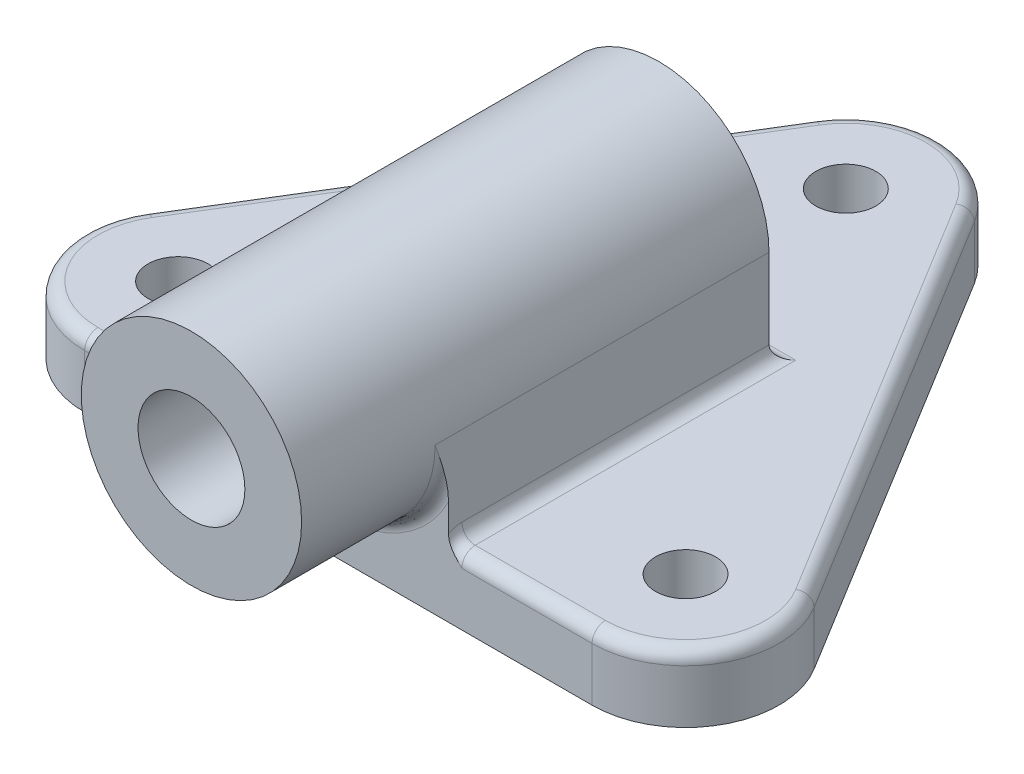
ISO-10303-21;
HEADER;
FILE_DESCRIPTION(('STEP AP214'),'2;1');
FILE_NAME('part.step','',(''),(''),'','','');
FILE_SCHEMA(('AUTOMOTIVE_DESIGN { 1 0 10303 214 1 1 1 1 }'));
ENDSEC;
DATA;
#1=APPLICATION_CONTEXT('core data for automotive mechanical design processes');
#2=APPLICATION_PROTOCOL_DEFINITION('international standard','automotive_design',2000,#1);
#3=PRODUCT_CONTEXT('',#1,'mechanical');
#4=PRODUCT('Part','Part','',(#3));
#5=PRODUCT_RELATED_PRODUCT_CATEGORY('part','',(#4));
#6=PRODUCT_DEFINITION_FORMATION('','',#4);
#7=PRODUCT_DEFINITION_CONTEXT('part definition',#1,'design');
#8=PRODUCT_DEFINITION('design','',#6,#7);
#9=PRODUCT_DEFINITION_SHAPE('','',#8);
#10=(LENGTH_UNIT() NAMED_UNIT(*) SI_UNIT(.MILLI.,.METRE.));
#11=(NAMED_UNIT(*) PLANE_ANGLE_UNIT() SI_UNIT($,.RADIAN.));
#12=(NAMED_UNIT(*) SI_UNIT($,.STERADIAN.) SOLID_ANGLE_UNIT());
#13=UNCERTAINTY_MEASURE_WITH_UNIT(LENGTH_MEASURE(1.E-05),#10,'distance_accuracy_value','');
#14=(GEOMETRIC_REPRESENTATION_CONTEXT(3) GLOBAL_UNCERTAINTY_ASSIGNED_CONTEXT((#13)) GLOBAL_UNIT_ASSIGNED_CONTEXT((#10,
#11,#12)) REPRESENTATION_CONTEXT('',''));
#15=CARTESIAN_POINT('',(0.,0.,0.));
#16=DIRECTION('',(0.,0.,1.));
#17=DIRECTION('',(1.,0.,0.));
#18=AXIS2_PLACEMENT_3D('',#15,#16,#17);
#19=CARTESIAN_POINT('',(38.,10.,-14.));
#20=DIRECTION('',(0.,1.,0.));
#21=DIRECTION('',(0.,0.,1.));
#22=AXIS2_PLACEMENT_3D('',#19,#20,#21);
#23=PLANE('',#22);
#24=DIRECTION('',(1.,0.,0.));
#25=VECTOR('',#24,1.);
#26=CARTESIAN_POINT('',(38.,10.,-50.));
#27=LINE('',#26,#25);
#28=CARTESIAN_POINT('',(-18.5,10.,-50.));
#29=VERTEX_POINT('',#28);
#30=CARTESIAN_POINT('',(18.5,10.,-50.));
#31=VERTEX_POINT('',#30);
#32=EDGE_CURVE('E448',#29,#31,#27,.T.);
#33=ORIENTED_EDGE('',*,*,#32,.T.);
#34=DIRECTION('',(0.,0.,1.));
#35=VECTOR('',#34,1.);
#36=CARTESIAN_POINT('',(18.5,10.,-14.));
#37=LINE('',#36,#35);
#38=CARTESIAN_POINT('',(18.5,10.,-2.));
#39=VERTEX_POINT('',#38);
#40=EDGE_CURVE('E321',#31,#39,#37,.T.);
#41=ORIENTED_EDGE('',*,*,#40,.T.);
#42=DIRECTION('',(1.,0.,0.));
#43=VECTOR('',#42,1.);
#44=CARTESIAN_POINT('',(38.,10.,-2.));
#45=LINE('',#44,#43);
#46=CARTESIAN_POINT('',(38.,10.,-2.00000000000001));
#47=VERTEX_POINT('',#46);
#48=EDGE_CURVE('E272',#39,#47,#45,.T.);
#49=ORIENTED_EDGE('',*,*,#48,.T.);
#50=CARTESIAN_POINT('',(38.,10.,-14.));
#51=DIRECTION('',(0.,1.,0.));
#52=DIRECTION('',(0.,0.,1.));
#53=AXIS2_PLACEMENT_3D('',#50,#51,#52);
#54=CIRCLE('',#53,12.);
#55=CARTESIAN_POINT('',(48.2312150289313,10.,-20.2707446951515));
#56=VERTEX_POINT('',#55);
#57=EDGE_CURVE('E259',#47,#56,#54,.T.);
#58=ORIENTED_EDGE('',*,*,#57,.T.);
#59=DIRECTION('',(-0.522562057929287,0.,-0.852601252410943));
#60=VECTOR('',#59,1.);
#61=CARTESIAN_POINT('',(10.2312150289313,10.,-82.2707446951515));
#62=LINE('',#61,#60);
#63=CARTESIAN_POINT('',(10.2312150289313,10.,-82.2707446951514));
#64=VERTEX_POINT('',#63);
#65=EDGE_CURVE('E261',#56,#64,#62,.T.);
#66=ORIENTED_EDGE('',*,*,#65,.T.);
#67=CARTESIAN_POINT('',(0.,10.,-76.));
#68=DIRECTION('',(0.,1.,0.));
#69=DIRECTION('',(0.,0.,1.));
#70=AXIS2_PLACEMENT_3D('',#67,#68,#69);
#71=CIRCLE('',#70,12.);
#72=CARTESIAN_POINT('',(-10.2312150289313,10.,-82.2707446951514));
#73=VERTEX_POINT('',#72);
#74=EDGE_CURVE('E263',#64,#73,#71,.T.);
#75=ORIENTED_EDGE('',*,*,#74,.T.);
#76=DIRECTION('',(-0.522562057929287,0.,0.852601252410943));
#77=VECTOR('',#76,1.);
#78=CARTESIAN_POINT('',(-48.2312150289313,10.,-20.2707446951514));
#79=LINE('',#78,#77);
#80=CARTESIAN_POINT('',(-48.2312150289313,10.,-20.2707446951514));
#81=VERTEX_POINT('',#80);
#82=EDGE_CURVE('E265',#73,#81,#79,.T.);
#83=ORIENTED_EDGE('',*,*,#82,.T.);
#84=CARTESIAN_POINT('',(-38.,10.,-14.));
#85=DIRECTION('',(0.,1.,0.));
#86=DIRECTION('',(0.,0.,1.));
#87=AXIS2_PLACEMENT_3D('',#84,#85,#86);
#88=CIRCLE('',#87,12.);
#89=CARTESIAN_POINT('',(-38.,10.,-2.));
#90=VERTEX_POINT('',#89);
#91=EDGE_CURVE('E267',#81,#90,#88,.T.);
#92=ORIENTED_EDGE('',*,*,#91,.T.);
#93=DIRECTION('',(1.,0.,0.));
#94=VECTOR('',#93,1.);
#95=CARTESIAN_POINT('',(-16.5,10.,-2.));
#96=LINE('',#95,#94);
#97=CARTESIAN_POINT('',(-18.5,10.,-1.99999999999999));
#98=VERTEX_POINT('',#97);
#99=EDGE_CURVE('E269',#90,#98,#96,.T.);
#100=ORIENTED_EDGE('',*,*,#99,.T.);
#101=DIRECTION('',(0.,0.,1.));
#102=VECTOR('',#101,1.);
#103=CARTESIAN_POINT('',(-18.5,10.,-48.));
#104=LINE('',#103,#102);
#105=EDGE_CURVE('E323',#98,#29,#104,.F.);
#106=ORIENTED_EDGE('',*,*,#105,.T.);
#107=EDGE_LOOP('',(#33,#41,#49,#58,#66,#75,#83,#92,#100,#106));
#108=FACE_BOUND('',#107,.T.);
#109=CARTESIAN_POINT('',(0.,10.,-76.));
#110=DIRECTION('',(0.,1.,0.));
#111=DIRECTION('',(0.,0.,1.));
#112=AXIS2_PLACEMENT_3D('',#109,#110,#111);
#113=CIRCLE('',#112,4.5);
#114=CARTESIAN_POINT('',(0.,10.,-71.5));
#115=VERTEX_POINT('',#114);
#116=EDGE_CURVE('E218',#115,#115,#113,.T.);
#117=ORIENTED_EDGE('',*,*,#116,.F.);
#118=EDGE_LOOP('',(#117));
#119=FACE_BOUND('',#118,.T.);
#120=CARTESIAN_POINT('',(-38.,10.,-14.));
#121=DIRECTION('',(0.,1.,0.));
#122=DIRECTION('',(0.,0.,1.));
#123=AXIS2_PLACEMENT_3D('',#120,#121,#122);
#124=CIRCLE('',#123,4.5);
#125=CARTESIAN_POINT('',(-38.,10.,-9.50000000000001));
#126=VERTEX_POINT('',#125);
#127=EDGE_CURVE('E224',#126,#126,#124,.T.);
#128=ORIENTED_EDGE('',*,*,#127,.F.);
#129=EDGE_LOOP('',(#128));
#130=FACE_BOUND('',#129,.T.);
#131=CARTESIAN_POINT('',(38.,10.,-14.));
#132=DIRECTION('',(0.,1.,0.));
#133=DIRECTION('',(0.,0.,1.));
#134=AXIS2_PLACEMENT_3D('',#131,#132,#133);
#135=CIRCLE('',#134,4.5);
#136=CARTESIAN_POINT('',(38.,10.,-9.50000000000002));
#137=VERTEX_POINT('',#136);
#138=EDGE_CURVE('E212',#137,#137,#135,.T.);
#139=ORIENTED_EDGE('',*,*,#138,.F.);
#140=EDGE_LOOP('',(#139));
#141=FACE_BOUND('',#140,.T.);
#142=ADVANCED_FACE('F53',(#108,#119,#130,#141),#23,.T.);
#143=CARTESIAN_POINT('',(0.,24.,-48.));
#144=DIRECTION('',(0.,0.,1.));
#145=DIRECTION('',(1.,0.,0.));
#146=AXIS2_PLACEMENT_3D('',#143,#144,#145);
#147=CYLINDRICAL_SURFACE('',#146,16.5);
#148=DIRECTION('',(0.,0.,1.));
#149=VECTOR('',#148,1.);
#150=CARTESIAN_POINT('',(-16.5,24.,-48.));
#151=LINE('',#150,#149);
#152=CARTESIAN_POINT('',(-16.5,24.,-48.));
#153=VERTEX_POINT('',#152);
#154=CARTESIAN_POINT('',(-16.5,24.,2.00000000000001));
#155=VERTEX_POINT('',#154);
#156=EDGE_CURVE('E74',#153,#155,#151,.T.);
#157=ORIENTED_EDGE('',*,*,#156,.T.);
#158=CARTESIAN_POINT('',(0.,24.,2.00000000000001));
#159=DIRECTION('',(0.,0.,-1.));
#160=DIRECTION('',(-1.,0.,0.));
#161=AXIS2_PLACEMENT_3D('',#158,#159,#160);
#162=CIRCLE('',#161,16.5);
#163=CARTESIAN_POINT('',(16.5,24.,2.00000000000001));
#164=VERTEX_POINT('',#163);
#165=EDGE_CURVE('E196',#155,#164,#162,.F.);
#166=ORIENTED_EDGE('',*,*,#165,.T.);
#167=DIRECTION('',(0.,0.,1.));
#168=VECTOR('',#167,1.);
#169=CARTESIAN_POINT('',(16.5,24.,-48.));
#170=LINE('',#169,#168);
#171=CARTESIAN_POINT('',(16.5,24.,-48.));
#172=VERTEX_POINT('',#171);
#173=EDGE_CURVE('E81',#172,#164,#170,.T.);
#174=ORIENTED_EDGE('',*,*,#173,.F.);
#175=CARTESIAN_POINT('',(0.,24.,-48.));
#176=DIRECTION('',(0.,0.,1.));
#177=DIRECTION('',(1.,0.,0.));
#178=AXIS2_PLACEMENT_3D('',#175,#176,#177);
#179=CIRCLE('',#178,16.5);
#180=EDGE_CURVE('E184',#172,#153,#179,.T.);
#181=ORIENTED_EDGE('',*,*,#180,.T.);
#182=EDGE_LOOP('',(#157,#166,#174,#181));
#183=FACE_BOUND('',#182,.T.);
#184=CARTESIAN_POINT('',(0.,24.,22.));
#185=DIRECTION('',(0.,0.,1.));
#186=DIRECTION('',(1.,0.,0.));
#187=AXIS2_PLACEMENT_3D('',#184,#185,#186);
#188=CIRCLE('',#187,16.5);
#189=CARTESIAN_POINT('',(16.5,24.,22.));
#190=VERTEX_POINT('',#189);
#191=EDGE_CURVE('E191',#190,#190,#188,.T.);
#192=ORIENTED_EDGE('',*,*,#191,.F.);
#193=EDGE_LOOP('',(#192));
#194=FACE_BOUND('',#193,.T.);
#195=ADVANCED_FACE('F193',(#183,#194),#147,.T.);
#196=CARTESIAN_POINT('',(38.,0.,-14.));
#197=DIRECTION('',(0.,1.,0.));
#198=DIRECTION('',(0.,0.,1.));
#199=AXIS2_PLACEMENT_3D('',#196,#197,#198);
#200=PLANE('',#199);
#201=CARTESIAN_POINT('',(38.,0.,-14.));
#202=DIRECTION('',(0.,1.,0.));
#203=DIRECTION('',(0.,0.,1.));
#204=AXIS2_PLACEMENT_3D('',#201,#202,#203);
#205=CIRCLE('',#204,14.);
#206=CARTESIAN_POINT('',(38.,0.,0.));
#207=VERTEX_POINT('',#206);
#208=CARTESIAN_POINT('',(49.9364175337532,0.,-21.31586881101));
#209=VERTEX_POINT('',#208);
#210=EDGE_CURVE('E227',#207,#209,#205,.T.);
#211=ORIENTED_EDGE('',*,*,#210,.F.);
#212=DIRECTION('',(1.,0.,0.));
#213=VECTOR('',#212,1.);
#214=CARTESIAN_POINT('',(38.,0.,0.));
#215=LINE('',#214,#213);
#216=CARTESIAN_POINT('',(-38.,0.,0.));
#217=VERTEX_POINT('',#216);
#218=EDGE_CURVE('E244',#217,#207,#215,.T.);
#219=ORIENTED_EDGE('',*,*,#218,.F.);
#220=CARTESIAN_POINT('',(-38.,0.,-14.));
#221=DIRECTION('',(0.,1.,0.));
#222=DIRECTION('',(0.,0.,-1.));
#223=AXIS2_PLACEMENT_3D('',#220,#221,#222);
#224=CIRCLE('',#223,14.);
#225=CARTESIAN_POINT('',(-49.9364175337532,0.,-21.31586881101));
#226=VERTEX_POINT('',#225);
#227=EDGE_CURVE('E241',#226,#217,#224,.T.);
#228=ORIENTED_EDGE('',*,*,#227,.F.);
#229=DIRECTION('',(-0.522562057929287,0.,0.852601252410943));
#230=VECTOR('',#229,1.);
#231=CARTESIAN_POINT('',(-49.9364175337532,0.,-21.31586881101));
#232=LINE('',#231,#230);
#233=CARTESIAN_POINT('',(-11.9364175337532,0.,-83.31586881101));
#234=VERTEX_POINT('',#233);
#235=EDGE_CURVE('E238',#234,#226,#232,.T.);
#236=ORIENTED_EDGE('',*,*,#235,.F.);
#237=CARTESIAN_POINT('',(0.,0.,-76.));
#238=DIRECTION('',(0.,1.,0.));
#239=DIRECTION('',(0.,0.,-1.));
#240=AXIS2_PLACEMENT_3D('',#237,#238,#239);
#241=CIRCLE('',#240,14.);
#242=CARTESIAN_POINT('',(11.9364175337532,0.,-83.31586881101));
#243=VERTEX_POINT('',#242);
#244=EDGE_CURVE('E235',#243,#234,#241,.T.);
#245=ORIENTED_EDGE('',*,*,#244,.F.);
#246=DIRECTION('',(-0.522562057929287,0.,-0.852601252410943));
#247=VECTOR('',#246,1.);
#248=CARTESIAN_POINT('',(11.9364175337532,0.,-83.31586881101));
#249=LINE('',#248,#247);
#250=EDGE_CURVE('E232',#209,#243,#249,.T.);
#251=ORIENTED_EDGE('',*,*,#250,.F.);
#252=EDGE_LOOP('',(#211,#219,#228,#236,#245,#251));
#253=FACE_BOUND('',#252,.T.);
#254=CARTESIAN_POINT('',(-38.,0.,-14.));
#255=DIRECTION('',(0.,1.,0.));
#256=DIRECTION('',(0.,0.,1.));
#257=AXIS2_PLACEMENT_3D('',#254,#255,#256);
#258=CIRCLE('',#257,4.5);
#259=CARTESIAN_POINT('',(-38.,0.,-9.50000000000001));
#260=VERTEX_POINT('',#259);
#261=EDGE_CURVE('E221',#260,#260,#258,.T.);
#262=ORIENTED_EDGE('',*,*,#261,.T.);
#263=EDGE_LOOP('',(#262));
#264=FACE_BOUND('',#263,.T.);
#265=CARTESIAN_POINT('',(0.,0.,-76.));
#266=DIRECTION('',(0.,1.,0.));
#267=DIRECTION('',(0.,0.,1.));
#268=AXIS2_PLACEMENT_3D('',#265,#266,#267);
#269=CIRCLE('',#268,4.5);
#270=CARTESIAN_POINT('',(0.,0.,-71.5));
#271=VERTEX_POINT('',#270);
#272=EDGE_CURVE('E215',#271,#271,#269,.T.);
#273=ORIENTED_EDGE('',*,*,#272,.T.);
#274=EDGE_LOOP('',(#273));
#275=FACE_BOUND('',#274,.T.);
#276=CARTESIAN_POINT('',(38.,0.,-14.));
#277=DIRECTION('',(0.,1.,0.));
#278=DIRECTION('',(0.,0.,1.));
#279=AXIS2_PLACEMENT_3D('',#276,#277,#278);
#280=CIRCLE('',#279,4.5);
#281=CARTESIAN_POINT('',(38.,0.,-9.50000000000002));
#282=VERTEX_POINT('',#281);
#283=EDGE_CURVE('E190',#282,#282,#280,.T.);
#284=ORIENTED_EDGE('',*,*,#283,.T.);
#285=EDGE_LOOP('',(#284));
#286=FACE_BOUND('',#285,.T.);
#287=ADVANCED_FACE('F383',(#253,#264,#275,#286),#200,.F.);
#288=CARTESIAN_POINT('',(38.,10.,-14.));
#289=DIRECTION('',(0.,-1.,0.));
#290=DIRECTION('',(0.,0.,-1.));
#291=AXIS2_PLACEMENT_3D('',#288,#289,#290);
#292=CYLINDRICAL_SURFACE('',#291,14.);
#293=DIRECTION('',(0.,-1.,0.));
#294=VECTOR('',#293,1.);
#295=CARTESIAN_POINT('',(49.9364175337532,10.,-21.31586881101));
#296=LINE('',#295,#294);
#297=CARTESIAN_POINT('',(49.9364175337532,8.,-21.31586881101));
#298=VERTEX_POINT('',#297);
#299=EDGE_CURVE('E257',#298,#209,#296,.T.);
#300=ORIENTED_EDGE('',*,*,#299,.F.);
#301=CARTESIAN_POINT('',(38.,8.,-14.));
#302=DIRECTION('',(0.,1.,0.));
#303=DIRECTION('',(0.,0.,1.));
#304=AXIS2_PLACEMENT_3D('',#301,#302,#303);
#305=CIRCLE('',#304,14.);
#306=CARTESIAN_POINT('',(38.,8.,0.));
#307=VERTEX_POINT('',#306);
#308=EDGE_CURVE('E287',#298,#307,#305,.F.);
#309=ORIENTED_EDGE('',*,*,#308,.T.);
#310=DIRECTION('',(0.,-1.,0.));
#311=VECTOR('',#310,1.);
#312=CARTESIAN_POINT('',(38.,10.,0.));
#313=LINE('',#312,#311);
#314=EDGE_CURVE('E247',#307,#207,#313,.T.);
#315=ORIENTED_EDGE('',*,*,#314,.T.);
#316=ORIENTED_EDGE('',*,*,#210,.T.);
#317=EDGE_LOOP('',(#300,#309,#315,#316));
#318=FACE_BOUND('',#317,.T.);
#319=ADVANCED_FACE('F391',(#318),#292,.T.);
#320=CARTESIAN_POINT('',(11.9364175337532,10.,-83.31586881101));
#321=DIRECTION('',(-0.852601252410943,0.,0.522562057929287));
#322=DIRECTION('',(0.522562057929287,0.,0.852601252410943));
#323=AXIS2_PLACEMENT_3D('',#320,#321,#322);
#324=PLANE('',#323);
#325=DIRECTION('',(0.,-1.,0.));
#326=VECTOR('',#325,1.);
#327=CARTESIAN_POINT('',(11.9364175337532,10.,-83.31586881101));
#328=LINE('',#327,#326);
#329=CARTESIAN_POINT('',(11.9364175337532,8.,-83.31586881101));
#330=VERTEX_POINT('',#329);
#331=EDGE_CURVE('E255',#330,#243,#328,.T.);
#332=ORIENTED_EDGE('',*,*,#331,.F.);
#333=DIRECTION('',(-0.522562057929287,0.,-0.852601252410943));
#334=VECTOR('',#333,1.);
#335=CARTESIAN_POINT('',(49.9364175337532,8.,-21.31586881101));
#336=LINE('',#335,#334);
#337=EDGE_CURVE('E285',#330,#298,#336,.F.);
#338=ORIENTED_EDGE('',*,*,#337,.T.);
#339=ORIENTED_EDGE('',*,*,#299,.T.);
#340=ORIENTED_EDGE('',*,*,#250,.T.);
#341=EDGE_LOOP('',(#332,#338,#339,#340));
#342=FACE_BOUND('',#341,.T.);
#343=ADVANCED_FACE('F396',(#342),#324,.F.);
#344=CARTESIAN_POINT('',(0.,10.,-76.));
#345=DIRECTION('',(0.,-1.,0.));
#346=DIRECTION('',(0.,0.,-1.));
#347=AXIS2_PLACEMENT_3D('',#344,#345,#346);
#348=CYLINDRICAL_SURFACE('',#347,14.);
#349=DIRECTION('',(0.,-1.,0.));
#350=VECTOR('',#349,1.);
#351=CARTESIAN_POINT('',(-11.9364175337532,10.,-83.31586881101));
#352=LINE('',#351,#350);
#353=CARTESIAN_POINT('',(-11.9364175337532,8.,-83.31586881101));
#354=VERTEX_POINT('',#353);
#355=EDGE_CURVE('E253',#354,#234,#352,.T.);
#356=ORIENTED_EDGE('',*,*,#355,.F.);
#357=CARTESIAN_POINT('',(0.,8.,-76.));
#358=DIRECTION('',(0.,1.,0.));
#359=DIRECTION('',(0.,0.,1.));
#360=AXIS2_PLACEMENT_3D('',#357,#358,#359);
#361=CIRCLE('',#360,14.);
#362=EDGE_CURVE('E283',#354,#330,#361,.F.);
#363=ORIENTED_EDGE('',*,*,#362,.T.);
#364=ORIENTED_EDGE('',*,*,#331,.T.);
#365=ORIENTED_EDGE('',*,*,#244,.T.);
#366=EDGE_LOOP('',(#356,#363,#364,#365));
#367=FACE_BOUND('',#366,.T.);
#368=ADVANCED_FACE('F746',(#367),#348,.T.);
#369=CARTESIAN_POINT('',(-49.9364175337532,10.,-21.31586881101));
#370=DIRECTION('',(0.852601252410943,0.,0.522562057929287));
#371=DIRECTION('',(0.522562057929287,0.,-0.852601252410943));
#372=AXIS2_PLACEMENT_3D('',#369,#370,#371);
#373=PLANE('',#372);
#374=DIRECTION('',(0.,-1.,0.));
#375=VECTOR('',#374,1.);
#376=CARTESIAN_POINT('',(-49.9364175337532,10.,-21.31586881101));
#377=LINE('',#376,#375);
#378=CARTESIAN_POINT('',(-49.9364175337532,8.,-21.31586881101));
#379=VERTEX_POINT('',#378);
#380=EDGE_CURVE('E251',#379,#226,#377,.T.);
#381=ORIENTED_EDGE('',*,*,#380,.F.);
#382=DIRECTION('',(-0.522562057929287,0.,0.852601252410943));
#383=VECTOR('',#382,1.);
#384=CARTESIAN_POINT('',(-11.9364175337532,8.,-83.31586881101));
#385=LINE('',#384,#383);
#386=EDGE_CURVE('E281',#379,#354,#385,.F.);
#387=ORIENTED_EDGE('',*,*,#386,.T.);
#388=ORIENTED_EDGE('',*,*,#355,.T.);
#389=ORIENTED_EDGE('',*,*,#235,.T.);
#390=EDGE_LOOP('',(#381,#387,#388,#389));
#391=FACE_BOUND('',#390,.T.);
#392=ADVANCED_FACE('F475',(#391),#373,.F.);
#393=CARTESIAN_POINT('',(-38.,10.,-14.));
#394=DIRECTION('',(0.,-1.,0.));
#395=DIRECTION('',(0.,0.,-1.));
#396=AXIS2_PLACEMENT_3D('',#393,#394,#395);
#397=CYLINDRICAL_SURFACE('',#396,14.);
#398=DIRECTION('',(0.,-1.,0.));
#399=VECTOR('',#398,1.);
#400=CARTESIAN_POINT('',(-38.,10.,0.));
#401=LINE('',#400,#399);
#402=CARTESIAN_POINT('',(-38.,8.,0.));
#403=VERTEX_POINT('',#402);
#404=EDGE_CURVE('E249',#403,#217,#401,.T.);
#405=ORIENTED_EDGE('',*,*,#404,.F.);
#406=CARTESIAN_POINT('',(-38.,8.,-14.));
#407=DIRECTION('',(0.,1.,0.));
#408=DIRECTION('',(0.,0.,1.));
#409=AXIS2_PLACEMENT_3D('',#406,#407,#408);
#410=CIRCLE('',#409,14.);
#411=EDGE_CURVE('E279',#403,#379,#410,.F.);
#412=ORIENTED_EDGE('',*,*,#411,.T.);
#413=ORIENTED_EDGE('',*,*,#380,.T.);
#414=ORIENTED_EDGE('',*,*,#227,.T.);
#415=EDGE_LOOP('',(#405,#412,#413,#414));
#416=FACE_BOUND('',#415,.T.);
#417=ADVANCED_FACE('F473',(#416),#397,.T.);
#418=CARTESIAN_POINT('',(38.,10.,0.));
#419=DIRECTION('',(0.,0.,-1.));
#420=DIRECTION('',(-1.,0.,0.));
#421=AXIS2_PLACEMENT_3D('',#418,#419,#420);
#422=PLANE('',#421);
#423=DIRECTION('',(0.,-1.,0.));
#424=VECTOR('',#423,1.);
#425=CARTESIAN_POINT('',(16.5,0.,0.));
#426=LINE('',#425,#424);
#427=CARTESIAN_POINT('',(16.5,15.6333997346592,0.));
#428=VERTEX_POINT('',#427);
#429=CARTESIAN_POINT('',(16.5,11.4641016151378,0.));
#430=VERTEX_POINT('',#429);
#431=EDGE_CURVE('E204',#428,#430,#426,.T.);
#432=ORIENTED_EDGE('',*,*,#431,.F.);
#433=CARTESIAN_POINT('',(0.,24.,0.));
#434=DIRECTION('',(0.,0.,-1.));
#435=DIRECTION('',(-1.,0.,0.));
#436=AXIS2_PLACEMENT_3D('',#433,#434,#435);
#437=CIRCLE('',#436,18.5);
#438=CARTESIAN_POINT('',(-16.5,15.6333997346592,0.));
#439=VERTEX_POINT('',#438);
#440=EDGE_CURVE('E438',#428,#439,#437,.T.);
#441=ORIENTED_EDGE('',*,*,#440,.T.);
#442=DIRECTION('',(0.,-1.,0.));
#443=VECTOR('',#442,1.);
#444=CARTESIAN_POINT('',(-16.5,0.,0.));
#445=LINE('',#444,#443);
#446=CARTESIAN_POINT('',(-16.5,11.4641016151378,0.));
#447=VERTEX_POINT('',#446);
#448=EDGE_CURVE('E309',#439,#447,#445,.T.);
#449=ORIENTED_EDGE('',*,*,#448,.T.);
#450=CARTESIAN_POINT('',(-16.5,11.4641016151378,0.));
#451=CARTESIAN_POINT('',(-16.4999881505854,11.3784062981242,0.));
#452=CARTESIAN_POINT('',(-16.504128939751,11.2927610594971,0.));
#453=CARTESIAN_POINT('',(-16.5201470604538,11.1223210248082,0.));
#454=CARTESIAN_POINT('',(-16.5320126185145,11.0375251336161,0.));
#455=CARTESIAN_POINT('',(-16.5627287730669,10.8702831453065,0.));
#456=CARTESIAN_POINT('',(-16.5814935023679,10.7878210468179,0.));
#457=CARTESIAN_POINT('',(-16.6254388290681,10.6245989521641,0.));
#458=CARTESIAN_POINT('',(-16.6506224912804,10.5438397890896,0.));
#459=CARTESIAN_POINT('',(-16.7172470542596,10.3547324950866,0.));
#460=CARTESIAN_POINT('',(-16.7612516121676,10.2472841566028,0.));
#461=CARTESIAN_POINT('',(-16.8586457173185,10.0366927672736,0.));
#462=CARTESIAN_POINT('',(-16.9120427707876,9.93355324211471,0.));
#463=CARTESIAN_POINT('',(-17.0845375476102,9.6299986678065,0.));
#464=CARTESIAN_POINT('',(-17.2155906576633,9.43636862067546,0.));
#465=CARTESIAN_POINT('',(-17.5272402304038,9.02688369414127,0.));
#466=CARTESIAN_POINT('',(-17.7124774804831,8.81471515121597,0.));
#467=CARTESIAN_POINT('',(-18.096358453238,8.40378336819427,0.));
#468=CARTESIAN_POINT('',(-18.2949916479009,8.2050098408903,0.));
#469=CARTESIAN_POINT('',(-18.4957836320311,8.00421636814438,0.));
#470=CARTESIAN_POINT('',(-18.4978918171785,8.00210818300135,0.));
#471=CARTESIAN_POINT('',(-18.5,8.,0.));
#472=B_SPLINE_CURVE_WITH_KNOTS('',3,(#450,#451,#452,#453,#454,#455,#456,#457,#458,#459,#460,
#461,#462,#463,#464,#465,#466,#467,#468,#469,#470,#471),.UNSPECIFIED.,.F.,.F.,(4,2,2,2,2,2,2,2,
2,2,4),(0.,0.256912595778002,0.513434539685442,0.76686629139051,1.02041927520561,
1.36819331305802,1.71624655574892,2.41527069662684,3.25887239086185,4.10181864660846,
4.11076291851909),.UNSPECIFIED.);
#473=CARTESIAN_POINT('',(-18.5,8.,0.));
#474=VERTEX_POINT('',#473);
#475=EDGE_CURVE('E325',#447,#474,#472,.T.);
#476=ORIENTED_EDGE('',*,*,#475,.T.);
#477=DIRECTION('',(1.,0.,0.));
#478=VECTOR('',#477,1.);
#479=CARTESIAN_POINT('',(-38.,8.,0.));
#480=LINE('',#479,#478);
#481=EDGE_CURVE('E274',#474,#403,#480,.F.);
#482=ORIENTED_EDGE('',*,*,#481,.T.);
#483=ORIENTED_EDGE('',*,*,#404,.T.);
#484=ORIENTED_EDGE('',*,*,#218,.T.);
#485=ORIENTED_EDGE('',*,*,#314,.F.);
#486=DIRECTION('',(1.,0.,0.));
#487=VECTOR('',#486,1.);
#488=CARTESIAN_POINT('',(16.5,8.,0.));
#489=LINE('',#488,#487);
#490=CARTESIAN_POINT('',(18.5,8.,0.));
#491=VERTEX_POINT('',#490);
#492=EDGE_CURVE('E276',#307,#491,#489,.F.);
#493=ORIENTED_EDGE('',*,*,#492,.T.);
#494=CARTESIAN_POINT('',(16.5,11.4641016151378,0.));
#495=CARTESIAN_POINT('',(16.4999881505854,11.3784062981242,0.));
#496=CARTESIAN_POINT('',(16.504128939751,11.2927610594971,0.));
#497=CARTESIAN_POINT('',(16.5201470604538,11.1223210248082,0.));
#498=CARTESIAN_POINT('',(16.5320126185145,11.0375251336161,0.));
#499=CARTESIAN_POINT('',(16.5627287730669,10.8702831453065,0.));
#500=CARTESIAN_POINT('',(16.5814935023679,10.7878210468179,0.));
#501=CARTESIAN_POINT('',(16.6254388290681,10.6245989521641,0.));
#502=CARTESIAN_POINT('',(16.6506224912804,10.5438397890896,0.));
#503=CARTESIAN_POINT('',(16.7172470542596,10.3547324950866,0.));
#504=CARTESIAN_POINT('',(16.7612516121676,10.2472841566028,0.));
#505=CARTESIAN_POINT('',(16.8586457173185,10.0366927672736,0.));
#506=CARTESIAN_POINT('',(16.9120427707876,9.93355324211471,0.));
#507=CARTESIAN_POINT('',(17.0845375476102,9.62999866780651,0.));
#508=CARTESIAN_POINT('',(17.2155906576633,9.43636862067546,0.));
#509=CARTESIAN_POINT('',(17.5272402304038,9.02688369414127,0.));
#510=CARTESIAN_POINT('',(17.7124774804831,8.81471515121597,0.));
#511=CARTESIAN_POINT('',(18.096358453238,8.40378336819427,0.));
#512=CARTESIAN_POINT('',(18.2949916479009,8.2050098408903,0.));
#513=CARTESIAN_POINT('',(18.4957836320311,8.00421636814438,0.));
#514=CARTESIAN_POINT('',(18.4978918171785,8.00210818300135,0.));
#515=CARTESIAN_POINT('',(18.5,8.,0.));
#516=B_SPLINE_CURVE_WITH_KNOTS('',3,(#494,#495,#496,#497,#498,#499,#500,#501,#502,#503,#504,
#505,#506,#507,#508,#509,#510,#511,#512,#513,#514,#515),.UNSPECIFIED.,.F.,.F.,(4,2,2,2,2,2,2,2,
2,2,4),(0.,0.256912595778,0.513434539685442,0.76686629139051,1.02041927520561,1.36819331305802,
1.71624655574892,2.41527069662684,3.25887239086184,4.10181864660846,4.11076291851909),.UNSPECIFIED.);
#517=EDGE_CURVE('E333',#491,#430,#516,.F.);
#518=ORIENTED_EDGE('',*,*,#517,.T.);
#519=EDGE_LOOP('',(#432,#441,#449,#476,#482,#483,#484,#485,#493,#518));
#520=FACE_BOUND('',#519,.T.);
#521=ADVANCED_FACE('F340',(#520),#422,.F.);
#522=CARTESIAN_POINT('',(-38.,10.,-14.));
#523=DIRECTION('',(0.,-1.,0.));
#524=DIRECTION('',(0.,0.,-1.));
#525=AXIS2_PLACEMENT_3D('',#522,#523,#524);
#526=CYLINDRICAL_SURFACE('',#525,4.5);
#527=ORIENTED_EDGE('',*,*,#127,.T.);
#528=EDGE_LOOP('',(#527));
#529=FACE_BOUND('',#528,.T.);
#530=ORIENTED_EDGE('',*,*,#261,.F.);
#531=EDGE_LOOP('',(#530));
#532=FACE_BOUND('',#531,.T.);
#533=ADVANCED_FACE('F388',(#529,#532),#526,.F.);
#534=CARTESIAN_POINT('',(0.,10.,-76.));
#535=DIRECTION('',(0.,-1.,0.));
#536=DIRECTION('',(0.,0.,-1.));
#537=AXIS2_PLACEMENT_3D('',#534,#535,#536);
#538=CYLINDRICAL_SURFACE('',#537,4.5);
#539=ORIENTED_EDGE('',*,*,#116,.T.);
#540=EDGE_LOOP('',(#539));
#541=FACE_BOUND('',#540,.T.);
#542=ORIENTED_EDGE('',*,*,#272,.F.);
#543=EDGE_LOOP('',(#542));
#544=FACE_BOUND('',#543,.T.);
#545=ADVANCED_FACE('F412',(#541,#544),#538,.F.);
#546=CARTESIAN_POINT('',(38.,10.,-14.));
#547=DIRECTION('',(0.,-1.,0.));
#548=DIRECTION('',(0.,0.,-1.));
#549=AXIS2_PLACEMENT_3D('',#546,#547,#548);
#550=CYLINDRICAL_SURFACE('',#549,4.5);
#551=ORIENTED_EDGE('',*,*,#138,.T.);
#552=EDGE_LOOP('',(#551));
#553=FACE_BOUND('',#552,.T.);
#554=ORIENTED_EDGE('',*,*,#283,.F.);
#555=EDGE_LOOP('',(#554));
#556=FACE_BOUND('',#555,.T.);
#557=ADVANCED_FACE('F409',(#553,#556),#550,.F.);
#558=CARTESIAN_POINT('',(0.,0.,22.));
#559=DIRECTION('',(0.,0.,1.));
#560=DIRECTION('',(1.,0.,0.));
#561=AXIS2_PLACEMENT_3D('',#558,#559,#560);
#562=PLANE('',#561);
#563=CARTESIAN_POINT('',(0.,24.,22.));
#564=DIRECTION('',(0.,0.,1.));
#565=DIRECTION('',(1.,0.,0.));
#566=AXIS2_PLACEMENT_3D('',#563,#564,#565);
#567=CIRCLE('',#566,8.);
#568=CARTESIAN_POINT('',(8.,24.,22.));
#569=VERTEX_POINT('',#568);
#570=EDGE_CURVE('E487',#569,#569,#567,.T.);
#571=ORIENTED_EDGE('',*,*,#570,.F.);
#572=EDGE_LOOP('',(#571));
#573=FACE_BOUND('',#572,.T.);
#574=ORIENTED_EDGE('',*,*,#191,.T.);
#575=EDGE_LOOP('',(#574));
#576=FACE_BOUND('',#575,.T.);
#577=ADVANCED_FACE('F411',(#573,#576),#562,.T.);
#578=CARTESIAN_POINT('',(0.,0.,-48.));
#579=DIRECTION('',(0.,0.,1.));
#580=DIRECTION('',(1.,0.,0.));
#581=AXIS2_PLACEMENT_3D('',#578,#579,#580);
#582=PLANE('',#581);
#583=DIRECTION('',(0.,-1.,0.));
#584=VECTOR('',#583,1.);
#585=CARTESIAN_POINT('',(16.5,0.,-48.));
#586=LINE('',#585,#584);
#587=CARTESIAN_POINT('',(16.5,12.,-48.));
#588=VERTEX_POINT('',#587);
#589=EDGE_CURVE('E186',#172,#588,#586,.T.);
#590=ORIENTED_EDGE('',*,*,#589,.T.);
#591=DIRECTION('',(1.,0.,0.));
#592=VECTOR('',#591,1.);
#593=CARTESIAN_POINT('',(0.,12.,-48.));
#594=LINE('',#593,#592);
#595=CARTESIAN_POINT('',(-16.5,12.,-48.));
#596=VERTEX_POINT('',#595);
#597=EDGE_CURVE('E446',#588,#596,#594,.F.);
#598=ORIENTED_EDGE('',*,*,#597,.T.);
#599=DIRECTION('',(0.,-1.,0.));
#600=VECTOR('',#599,1.);
#601=CARTESIAN_POINT('',(-16.5,0.,-48.));
#602=LINE('',#601,#600);
#603=EDGE_CURVE('E189',#153,#596,#602,.T.);
#604=ORIENTED_EDGE('',*,*,#603,.F.);
#605=ORIENTED_EDGE('',*,*,#180,.F.);
#606=EDGE_LOOP('',(#590,#598,#604,#605));
#607=FACE_BOUND('',#606,.T.);
#608=ADVANCED_FACE('F185',(#607),#582,.F.);
#609=CARTESIAN_POINT('',(16.5,0.,-48.));
#610=DIRECTION('',(-1.,0.,0.));
#611=DIRECTION('',(0.,0.,1.));
#612=AXIS2_PLACEMENT_3D('',#609,#610,#611);
#613=PLANE('',#612);
#614=ORIENTED_EDGE('',*,*,#173,.T.);
#615=CARTESIAN_POINT('',(16.5,15.6333997346592,0.));
#616=CARTESIAN_POINT('',(16.5,15.8034049569816,3.46388107622654E-05));
#617=CARTESIAN_POINT('',(16.5,15.9733572200482,0.00443147690196275));
#618=CARTESIAN_POINT('',(16.5,16.3128044810721,0.0209272348180516));
#619=CARTESIAN_POINT('',(16.5,16.4822996742588,0.033022054083326));
#620=CARTESIAN_POINT('',(16.5,16.8202690071009,0.0638577184451996));
#621=CARTESIAN_POINT('',(16.5,16.9887446053228,0.082583021783467));
#622=CARTESIAN_POINT('',(16.5,17.324958819852,0.125877746290723));
#623=CARTESIAN_POINT('',(16.5,17.4926973223363,0.150448039837482));
#624=CARTESIAN_POINT('',(16.5,17.9921674804977,0.231428183688749));
#625=CARTESIAN_POINT('',(16.5,18.322685973983,0.295361052527392));
#626=CARTESIAN_POINT('',(16.5,18.9804617668755,0.438805566405363));
#627=CARTESIAN_POINT('',(16.5,19.3077166988608,0.518327762832621));
#628=CARTESIAN_POINT('',(16.5,20.0007267611424,0.70016340553717));
#629=CARTESIAN_POINT('',(16.5,20.366054205013,0.804090914137899));
#630=CARTESIAN_POINT('',(16.5,21.0933908579361,1.02259215779032));
#631=CARTESIAN_POINT('',(16.5,21.4554006562328,1.13716396041762));
#632=CARTESIAN_POINT('',(16.5,22.5391578170068,1.49147802417254));
#633=CARTESIAN_POINT('',(16.5,23.257498814183,1.74149512982141));
#634=CARTESIAN_POINT('',(16.5,23.9838252847597,1.99436869857026));
#635=CARTESIAN_POINT('',(16.5,23.9919126456738,1.9971843564379));
#636=CARTESIAN_POINT('',(16.5,24.,2.00000000000001));
#637=B_SPLINE_CURVE_WITH_KNOTS('',3,(#615,#616,#617,#618,#619,#620,#621,#622,#623,#624,#625,
#626,#627,#628,#629,#630,#631,#632,#633,#634,#635,#636),.UNSPECIFIED.,.F.,.F.,(4,2,2,2,2,2,2,2,
2,2,4),(0.,0.509884022950787,1.01949666800144,1.52792261080609,2.0364244849743,3.04580782164975,
4.05587671690411,5.19509971305216,6.33411629096549,8.61568468034457,8.64137514550575),.UNSPECIFIED.);
#638=EDGE_CURVE('E12',#164,#428,#637,.F.);
#639=ORIENTED_EDGE('',*,*,#638,.T.);
#640=ORIENTED_EDGE('',*,*,#431,.T.);
#641=CARTESIAN_POINT('',(16.5,8.,-2.));
#642=DIRECTION('',(-1.,0.,0.));
#643=DIRECTION('',(0.,0.,1.));
#644=AXIS2_PLACEMENT_3D('',#641,#642,#643);
#645=CIRCLE('',#644,4.);
#646=CARTESIAN_POINT('',(16.5,12.,-2.));
#647=VERTEX_POINT('',#646);
#648=EDGE_CURVE('E317',#430,#647,#645,.T.);
#649=ORIENTED_EDGE('',*,*,#648,.T.);
#650=DIRECTION('',(0.,0.,1.));
#651=VECTOR('',#650,1.);
#652=CARTESIAN_POINT('',(16.5,12.,-48.));
#653=LINE('',#652,#651);
#654=EDGE_CURVE('E203',#647,#588,#653,.F.);
#655=ORIENTED_EDGE('',*,*,#654,.T.);
#656=ORIENTED_EDGE('',*,*,#589,.F.);
#657=EDGE_LOOP('',(#614,#639,#640,#649,#655,#656));
#658=FACE_BOUND('',#657,.T.);
#659=ADVANCED_FACE('F200',(#658),#613,.F.);
#660=CARTESIAN_POINT('',(-16.5,0.,-48.));
#661=DIRECTION('',(-1.,0.,0.));
#662=DIRECTION('',(0.,0.,1.));
#663=AXIS2_PLACEMENT_3D('',#660,#661,#662);
#664=PLANE('',#663);
#665=DIRECTION('',(0.,0.,1.));
#666=VECTOR('',#665,1.);
#667=CARTESIAN_POINT('',(-16.5,12.,-1.99999999999999));
#668=LINE('',#667,#666);
#669=CARTESIAN_POINT('',(-16.5,12.,-1.99999999999999));
#670=VERTEX_POINT('',#669);
#671=EDGE_CURVE('E289',#596,#670,#668,.T.);
#672=ORIENTED_EDGE('',*,*,#671,.T.);
#673=CARTESIAN_POINT('',(-16.5,8.,-1.99999999999999));
#674=DIRECTION('',(-1.,0.,0.));
#675=DIRECTION('',(0.,0.,1.));
#676=AXIS2_PLACEMENT_3D('',#673,#674,#675);
#677=CIRCLE('',#676,4.);
#678=EDGE_CURVE('E311',#670,#447,#677,.F.);
#679=ORIENTED_EDGE('',*,*,#678,.T.);
#680=ORIENTED_EDGE('',*,*,#448,.F.);
#681=CARTESIAN_POINT('',(-16.5,15.6333997346592,0.));
#682=CARTESIAN_POINT('',(-16.5,15.8034049569816,3.46388107658713E-05));
#683=CARTESIAN_POINT('',(-16.5,15.9733572200482,0.00443147690196852));
#684=CARTESIAN_POINT('',(-16.5,16.3128044810723,0.0209272348180651));
#685=CARTESIAN_POINT('',(-16.5,16.482299674259,0.0330220540833451));
#686=CARTESIAN_POINT('',(-16.5,16.8202690071011,0.0638577184452311));
#687=CARTESIAN_POINT('',(-16.5,16.9887446053231,0.0825830217835049));
#688=CARTESIAN_POINT('',(-16.5,17.3249588198524,0.125877746290777));
#689=CARTESIAN_POINT('',(-16.5,17.4926973223367,0.150448039837544));
#690=CARTESIAN_POINT('',(-16.5,17.992167480498,0.231428183688819));
#691=CARTESIAN_POINT('',(-16.5,18.3226859739833,0.295361052527455));
#692=CARTESIAN_POINT('',(-16.5,18.9804617668756,0.438805566405393));
#693=CARTESIAN_POINT('',(-16.5,19.3077166988609,0.518327762832627));
#694=CARTESIAN_POINT('',(-16.5,20.0007267611424,0.700163405537189));
#695=CARTESIAN_POINT('',(-16.5,20.3660542050129,0.804090914137964));
#696=CARTESIAN_POINT('',(-16.5,21.0933908579361,1.02259215779025));
#697=CARTESIAN_POINT('',(-16.5,21.4554006562328,1.13716396041737));
#698=CARTESIAN_POINT('',(-16.5,22.5391578170066,1.49147802417301));
#699=CARTESIAN_POINT('',(-16.5,23.2574988141821,1.74149512982404));
#700=CARTESIAN_POINT('',(-16.5,23.9838252847597,1.99436869857033));
#701=CARTESIAN_POINT('',(-16.5,23.9919126456738,1.99718435643794));
#702=CARTESIAN_POINT('',(-16.5,24.,2.00000000000001));
#703=B_SPLINE_CURVE_WITH_KNOTS('',3,(#681,#682,#683,#684,#685,#686,#687,#688,#689,#690,#691,
#692,#693,#694,#695,#696,#697,#698,#699,#700,#701,#702),.UNSPECIFIED.,.F.,.F.,(4,2,2,2,2,2,2,2,
2,2,4),(0.,0.509884022950905,1.01949666800168,1.52792261080643,2.03642448497473,
3.04580782164995,4.05587671690411,5.19509971305215,6.33411629096542,8.61568468034458,
8.64137514550575),.UNSPECIFIED.);
#704=EDGE_CURVE('E67',#439,#155,#703,.T.);
#705=ORIENTED_EDGE('',*,*,#704,.T.);
#706=ORIENTED_EDGE('',*,*,#156,.F.);
#707=ORIENTED_EDGE('',*,*,#603,.T.);
#708=EDGE_LOOP('',(#672,#679,#680,#705,#706,#707));
#709=FACE_BOUND('',#708,.T.);
#710=ADVANCED_FACE('F427',(#709),#664,.T.);
#711=CARTESIAN_POINT('',(38.,8.,-2.));
#712=DIRECTION('',(-1.,0.,0.));
#713=DIRECTION('',(0.,0.,1.));
#714=AXIS2_PLACEMENT_3D('',#711,#712,#713);
#715=CYLINDRICAL_SURFACE('',#714,2.);
#716=ORIENTED_EDGE('',*,*,#481,.F.);
#717=CARTESIAN_POINT('',(-18.5,8.,-1.99999999999999));
#718=DIRECTION('',(-1.,0.,0.));
#719=DIRECTION('',(0.,0.,1.));
#720=AXIS2_PLACEMENT_3D('',#717,#718,#719);
#721=CIRCLE('',#720,2.);
#722=EDGE_CURVE('E314',#474,#98,#721,.T.);
#723=ORIENTED_EDGE('',*,*,#722,.T.);
#724=ORIENTED_EDGE('',*,*,#99,.F.);
#725=CARTESIAN_POINT('',(-38.,8.,-1.99999999999999));
#726=DIRECTION('',(-1.,0.,0.));
#727=DIRECTION('',(0.,0.,1.));
#728=AXIS2_PLACEMENT_3D('',#725,#726,#727);
#729=CIRCLE('',#728,2.);
#730=EDGE_CURVE('E306',#403,#90,#729,.T.);
#731=ORIENTED_EDGE('',*,*,#730,.F.);
#732=EDGE_LOOP('',(#716,#723,#724,#731));
#733=FACE_BOUND('',#732,.T.);
#734=ADVANCED_FACE('F352',(#733),#715,.T.);
#735=CARTESIAN_POINT('',(-38.,8.,-14.));
#736=DIRECTION('',(0.,1.,0.));
#737=DIRECTION('',(0.,0.,1.));
#738=AXIS2_PLACEMENT_3D('',#735,#736,#737);
#739=TOROIDAL_SURFACE('',#738,12.,2.);
#740=ORIENTED_EDGE('',*,*,#730,.T.);
#741=ORIENTED_EDGE('',*,*,#91,.F.);
#742=CARTESIAN_POINT('',(-48.2312150289313,8.,-20.2707446951514));
#743=DIRECTION('',(0.522562057929287,0.,-0.852601252410943));
#744=DIRECTION('',(-0.852601252410943,0.,-0.522562057929287));
#745=AXIS2_PLACEMENT_3D('',#742,#743,#744);
#746=CIRCLE('',#745,2.);
#747=EDGE_CURVE('E303',#379,#81,#746,.T.);
#748=ORIENTED_EDGE('',*,*,#747,.F.);
#749=ORIENTED_EDGE('',*,*,#411,.F.);
#750=EDGE_LOOP('',(#740,#741,#748,#749));
#751=FACE_BOUND('',#750,.T.);
#752=ADVANCED_FACE('F467',(#751),#739,.T.);
#753=CARTESIAN_POINT('',(-27.4778110954971,8.,-54.1315616391757));
#754=DIRECTION('',(0.522562057929287,0.,-0.852601252410943));
#755=DIRECTION('',(-0.852601252410943,0.,-0.522562057929287));
#756=AXIS2_PLACEMENT_3D('',#753,#754,#755);
#757=CYLINDRICAL_SURFACE('',#756,2.);
#758=ORIENTED_EDGE('',*,*,#747,.T.);
#759=ORIENTED_EDGE('',*,*,#82,.F.);
#760=CARTESIAN_POINT('',(-10.2312150289313,8.,-82.2707446951514));
#761=DIRECTION('',(0.52256205792929,0.,-0.852601252410941));
#762=DIRECTION('',(-0.852601252410941,0.,-0.52256205792929));
#763=AXIS2_PLACEMENT_3D('',#760,#761,#762);
#764=CIRCLE('',#763,2.);
#765=EDGE_CURVE('E300',#354,#73,#764,.T.);
#766=ORIENTED_EDGE('',*,*,#765,.F.);
#767=ORIENTED_EDGE('',*,*,#386,.F.);
#768=EDGE_LOOP('',(#758,#759,#766,#767));
#769=FACE_BOUND('',#768,.T.);
#770=ADVANCED_FACE('F641',(#769),#757,.T.);
#771=CARTESIAN_POINT('',(0.,8.,-76.));
#772=DIRECTION('',(0.,1.,0.));
#773=DIRECTION('',(0.,0.,1.));
#774=AXIS2_PLACEMENT_3D('',#771,#772,#773);
#775=TOROIDAL_SURFACE('',#774,12.,2.);
#776=ORIENTED_EDGE('',*,*,#765,.T.);
#777=ORIENTED_EDGE('',*,*,#74,.F.);
#778=CARTESIAN_POINT('',(10.2312150289313,8.,-82.2707446951514));
#779=DIRECTION('',(0.52256205792929,0.,0.852601252410941));
#780=DIRECTION('',(0.852601252410941,0.,-0.52256205792929));
#781=AXIS2_PLACEMENT_3D('',#778,#779,#780);
#782=CIRCLE('',#781,2.);
#783=EDGE_CURVE('E297',#330,#64,#782,.T.);
#784=ORIENTED_EDGE('',*,*,#783,.F.);
#785=ORIENTED_EDGE('',*,*,#362,.F.);
#786=EDGE_LOOP('',(#776,#777,#784,#785));
#787=FACE_BOUND('',#786,.T.);
#788=ADVANCED_FACE('F631',(#787),#775,.T.);
#789=CARTESIAN_POINT('',(48.2312150289313,8.,-20.2707446951515));
#790=DIRECTION('',(0.522562057929287,0.,0.852601252410943));
#791=DIRECTION('',(0.852601252410943,0.,-0.522562057929287));
#792=AXIS2_PLACEMENT_3D('',#789,#790,#791);
#793=CYLINDRICAL_SURFACE('',#792,2.);
#794=ORIENTED_EDGE('',*,*,#783,.T.);
#795=ORIENTED_EDGE('',*,*,#65,.F.);
#796=CARTESIAN_POINT('',(48.2312150289313,8.,-20.2707446951515));
#797=DIRECTION('',(0.522562057929287,0.,0.852601252410943));
#798=DIRECTION('',(0.852601252410943,0.,-0.522562057929287));
#799=AXIS2_PLACEMENT_3D('',#796,#797,#798);
#800=CIRCLE('',#799,2.);
#801=EDGE_CURVE('E293',#298,#56,#800,.T.);
#802=ORIENTED_EDGE('',*,*,#801,.F.);
#803=ORIENTED_EDGE('',*,*,#337,.F.);
#804=EDGE_LOOP('',(#794,#795,#802,#803));
#805=FACE_BOUND('',#804,.T.);
#806=ADVANCED_FACE('F621',(#805),#793,.T.);
#807=CARTESIAN_POINT('',(38.,8.,-14.));
#808=DIRECTION('',(0.,1.,0.));
#809=DIRECTION('',(0.,0.,1.));
#810=AXIS2_PLACEMENT_3D('',#807,#808,#809);
#811=TOROIDAL_SURFACE('',#810,12.,2.);
#812=ORIENTED_EDGE('',*,*,#801,.T.);
#813=ORIENTED_EDGE('',*,*,#57,.F.);
#814=CARTESIAN_POINT('',(38.,8.,-2.00000000000001));
#815=DIRECTION('',(-1.,0.,0.));
#816=DIRECTION('',(0.,0.,1.));
#817=AXIS2_PLACEMENT_3D('',#814,#815,#816);
#818=CIRCLE('',#817,2.);
#819=EDGE_CURVE('E290',#307,#47,#818,.T.);
#820=ORIENTED_EDGE('',*,*,#819,.F.);
#821=ORIENTED_EDGE('',*,*,#308,.F.);
#822=EDGE_LOOP('',(#812,#813,#820,#821));
#823=FACE_BOUND('',#822,.T.);
#824=ADVANCED_FACE('F611',(#823),#811,.T.);
#825=CARTESIAN_POINT('',(38.,8.,-2.));
#826=DIRECTION('',(-1.,0.,0.));
#827=DIRECTION('',(0.,0.,1.));
#828=AXIS2_PLACEMENT_3D('',#825,#826,#827);
#829=CYLINDRICAL_SURFACE('',#828,2.);
#830=ORIENTED_EDGE('',*,*,#48,.F.);
#831=CARTESIAN_POINT('',(18.5,8.,-2.));
#832=DIRECTION('',(-1.,0.,0.));
#833=DIRECTION('',(0.,0.,1.));
#834=AXIS2_PLACEMENT_3D('',#831,#832,#833);
#835=CIRCLE('',#834,2.);
#836=EDGE_CURVE('E319',#39,#491,#835,.F.);
#837=ORIENTED_EDGE('',*,*,#836,.T.);
#838=ORIENTED_EDGE('',*,*,#492,.F.);
#839=ORIENTED_EDGE('',*,*,#819,.T.);
#840=EDGE_LOOP('',(#830,#837,#838,#839));
#841=FACE_BOUND('',#840,.T.);
#842=ADVANCED_FACE('F355',(#841),#829,.T.);
#843=CARTESIAN_POINT('',(-18.5,12.,-48.));
#844=DIRECTION('',(0.,0.,-1.));
#845=DIRECTION('',(-1.,0.,0.));
#846=AXIS2_PLACEMENT_3D('',#843,#844,#845);
#847=CYLINDRICAL_SURFACE('',#846,2.);
#848=ORIENTED_EDGE('',*,*,#671,.F.);
#849=CARTESIAN_POINT('',(-18.5,12.,-50.));
#850=DIRECTION('',(0.707106781186547,0.,-0.707106781186547));
#851=DIRECTION('',(-0.707106781186547,0.,-0.707106781186547));
#852=AXIS2_PLACEMENT_3D('',#849,#850,#851);
#853=ELLIPSE('',#852,2.82842712474619,2.);
#854=EDGE_CURVE('E441',#596,#29,#853,.T.);
#855=ORIENTED_EDGE('',*,*,#854,.T.);
#856=ORIENTED_EDGE('',*,*,#105,.F.);
#857=CARTESIAN_POINT('',(-18.5,12.,-1.99999999999999));
#858=DIRECTION('',(0.,0.,-1.));
#859=DIRECTION('',(-1.,0.,0.));
#860=AXIS2_PLACEMENT_3D('',#857,#858,#859);
#861=CIRCLE('',#860,2.);
#862=EDGE_CURVE('E294',#670,#98,#861,.T.);
#863=ORIENTED_EDGE('',*,*,#862,.F.);
#864=EDGE_LOOP('',(#848,#855,#856,#863));
#865=FACE_BOUND('',#864,.T.);
#866=ADVANCED_FACE('F350',(#865),#847,.F.);
#867=CARTESIAN_POINT('',(-18.5,8.,-1.99999999999999));
#868=DIRECTION('',(-1.,0.,0.));
#869=DIRECTION('',(0.,0.,1.));
#870=AXIS2_PLACEMENT_3D('',#867,#868,#869);
#871=TOROIDAL_SURFACE('',#870,4.,2.);
#872=ORIENTED_EDGE('',*,*,#862,.T.);
#873=ORIENTED_EDGE('',*,*,#722,.F.);
#874=ORIENTED_EDGE('',*,*,#475,.F.);
#875=ORIENTED_EDGE('',*,*,#678,.F.);
#876=EDGE_LOOP('',(#872,#873,#874,#875));
#877=FACE_BOUND('',#876,.T.);
#878=ADVANCED_FACE('F344',(#877),#871,.F.);
#879=CARTESIAN_POINT('',(18.5,12.,-14.));
#880=DIRECTION('',(0.,0.,1.));
#881=DIRECTION('',(1.,0.,0.));
#882=AXIS2_PLACEMENT_3D('',#879,#880,#881);
#883=CYLINDRICAL_SURFACE('',#882,2.);
#884=ORIENTED_EDGE('',*,*,#40,.F.);
#885=CARTESIAN_POINT('',(18.5,12.,-50.));
#886=DIRECTION('',(0.707106781186547,0.,0.707106781186547));
#887=DIRECTION('',(-0.707106781186547,0.,0.707106781186547));
#888=AXIS2_PLACEMENT_3D('',#885,#886,#887);
#889=ELLIPSE('',#888,2.82842712474619,2.);
#890=EDGE_CURVE('E444',#31,#588,#889,.F.);
#891=ORIENTED_EDGE('',*,*,#890,.T.);
#892=ORIENTED_EDGE('',*,*,#654,.F.);
#893=CARTESIAN_POINT('',(18.5,12.,-2.));
#894=DIRECTION('',(0.,0.,-1.));
#895=DIRECTION('',(-1.,0.,0.));
#896=AXIS2_PLACEMENT_3D('',#893,#894,#895);
#897=CIRCLE('',#896,2.);
#898=EDGE_CURVE('E450',#39,#647,#897,.T.);
#899=ORIENTED_EDGE('',*,*,#898,.F.);
#900=EDGE_LOOP('',(#884,#891,#892,#899));
#901=FACE_BOUND('',#900,.T.);
#902=ADVANCED_FACE('F349',(#901),#883,.F.);
#903=CARTESIAN_POINT('',(18.5,8.,-2.));
#904=DIRECTION('',(-1.,0.,0.));
#905=DIRECTION('',(0.,0.,1.));
#906=AXIS2_PLACEMENT_3D('',#903,#904,#905);
#907=TOROIDAL_SURFACE('',#906,4.,2.);
#908=ORIENTED_EDGE('',*,*,#517,.F.);
#909=ORIENTED_EDGE('',*,*,#836,.F.);
#910=ORIENTED_EDGE('',*,*,#898,.T.);
#911=ORIENTED_EDGE('',*,*,#648,.F.);
#912=EDGE_LOOP('',(#908,#909,#910,#911));
#913=FACE_BOUND('',#912,.T.);
#914=ADVANCED_FACE('F357',(#913),#907,.F.);
#915=CARTESIAN_POINT('',(0.,24.,-32.));
#916=DIRECTION('',(0.,0.,1.));
#917=DIRECTION('',(1.,0.,0.));
#918=AXIS2_PLACEMENT_3D('',#915,#916,#917);
#919=CYLINDRICAL_SURFACE('',#918,8.);
#920=CARTESIAN_POINT('',(0.,24.,-32.));
#921=DIRECTION('',(0.,0.,1.));
#922=DIRECTION('',(1.,0.,0.));
#923=AXIS2_PLACEMENT_3D('',#920,#921,#922);
#924=CIRCLE('',#923,8.);
#925=CARTESIAN_POINT('',(8.,24.,-32.));
#926=VERTEX_POINT('',#925);
#927=EDGE_CURVE('E451',#926,#926,#924,.T.);
#928=ORIENTED_EDGE('',*,*,#927,.F.);
#929=EDGE_LOOP('',(#928));
#930=FACE_BOUND('',#929,.T.);
#931=ORIENTED_EDGE('',*,*,#570,.T.);
#932=EDGE_LOOP('',(#931));
#933=FACE_BOUND('',#932,.T.);
#934=ADVANCED_FACE('F361',(#930,#933),#919,.F.);
#935=CARTESIAN_POINT('',(0.,24.,-32.));
#936=DIRECTION('',(0.,0.,1.));
#937=DIRECTION('',(1.,0.,0.));
#938=AXIS2_PLACEMENT_3D('',#935,#936,#937);
#939=PLANE('',#938);
#940=ORIENTED_EDGE('',*,*,#927,.T.);
#941=EDGE_LOOP('',(#940));
#942=FACE_BOUND('',#941,.T.);
#943=ADVANCED_FACE('F367',(#942),#939,.T.);
#944=CARTESIAN_POINT('',(38.,12.,-50.));
#945=DIRECTION('',(1.,0.,0.));
#946=DIRECTION('',(0.,0.,-1.));
#947=AXIS2_PLACEMENT_3D('',#944,#945,#946);
#948=CYLINDRICAL_SURFACE('',#947,2.);
#949=ORIENTED_EDGE('',*,*,#854,.F.);
#950=ORIENTED_EDGE('',*,*,#597,.F.);
#951=ORIENTED_EDGE('',*,*,#890,.F.);
#952=ORIENTED_EDGE('',*,*,#32,.F.);
#953=EDGE_LOOP('',(#949,#950,#951,#952));
#954=FACE_BOUND('',#953,.T.);
#955=ADVANCED_FACE('F365',(#954),#948,.F.);
#956=CARTESIAN_POINT('',(0.,24.,2.00000000000001));
#957=DIRECTION('',(0.,0.,-1.));
#958=DIRECTION('',(-1.,0.,0.));
#959=AXIS2_PLACEMENT_3D('',#956,#957,#958);
#960=TOROIDAL_SURFACE('',#959,18.5,2.);
#961=ORIENTED_EDGE('',*,*,#638,.F.);
#962=ORIENTED_EDGE('',*,*,#165,.F.);
#963=ORIENTED_EDGE('',*,*,#704,.F.);
#964=ORIENTED_EDGE('',*,*,#440,.F.);
#965=EDGE_LOOP('',(#961,#962,#963,#964));
#966=FACE_BOUND('',#965,.T.);
#967=ADVANCED_FACE('F55',(#966),#960,.F.);
#968=CLOSED_SHELL('',(#142,#195,#287,#319,#343,#368,#392,#417,#521,#533,#545,#557,#577,#608,
#659,#710,#734,#752,#770,#788,#806,#824,#842,#866,#878,#902,#914,#934,#943,#955,#967));
#969=MANIFOLD_SOLID_BREP('B2',#968);
#970=ADVANCED_BREP_SHAPE_REPRESENTATION('',(#18,#969),#14);
#971=SHAPE_DEFINITION_REPRESENTATION(#9,#970);
ENDSEC;
END-ISO-10303-21;
